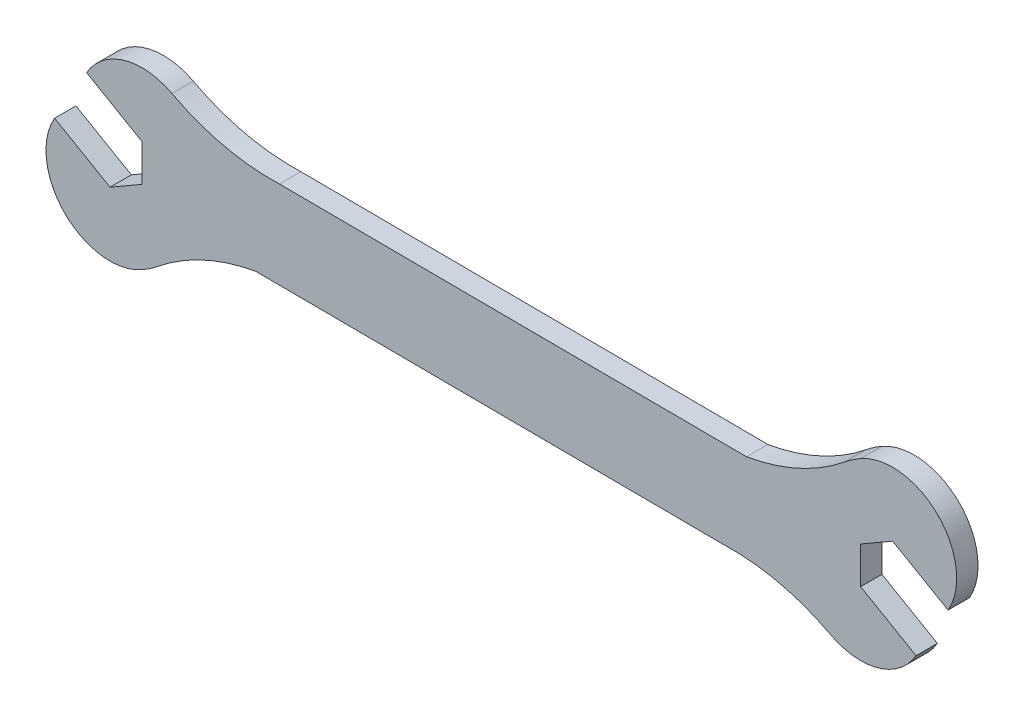
ISO-10303-21;
HEADER;
FILE_DESCRIPTION(('STEP AP214'),'2;1');
FILE_NAME('part.step','',(''),(''),'','','');
FILE_SCHEMA(('AUTOMOTIVE_DESIGN { 1 0 10303 214 1 1 1 1 }'));
ENDSEC;
DATA;
#1=APPLICATION_CONTEXT('core data for automotive mechanical design processes');
#2=APPLICATION_PROTOCOL_DEFINITION('international standard','automotive_design',2000,#1);
#3=PRODUCT_CONTEXT('',#1,'mechanical');
#4=PRODUCT('Part','Part','',(#3));
#5=PRODUCT_RELATED_PRODUCT_CATEGORY('part','',(#4));
#6=PRODUCT_DEFINITION_FORMATION('','',#4);
#7=PRODUCT_DEFINITION_CONTEXT('part definition',#1,'design');
#8=PRODUCT_DEFINITION('design','',#6,#7);
#9=PRODUCT_DEFINITION_SHAPE('','',#8);
#10=(LENGTH_UNIT() NAMED_UNIT(*) SI_UNIT(.MILLI.,.METRE.));
#11=(NAMED_UNIT(*) PLANE_ANGLE_UNIT() SI_UNIT($,.RADIAN.));
#12=(NAMED_UNIT(*) SI_UNIT($,.STERADIAN.) SOLID_ANGLE_UNIT());
#13=UNCERTAINTY_MEASURE_WITH_UNIT(LENGTH_MEASURE(1.E-05),#10,'distance_accuracy_value','');
#14=(GEOMETRIC_REPRESENTATION_CONTEXT(3) GLOBAL_UNCERTAINTY_ASSIGNED_CONTEXT((#13)) GLOBAL_UNIT_ASSIGNED_CONTEXT((#10,
#11,#12)) REPRESENTATION_CONTEXT('',''));
#15=CARTESIAN_POINT('',(0.,0.,0.));
#16=DIRECTION('',(0.,0.,1.));
#17=DIRECTION('',(1.,0.,0.));
#18=AXIS2_PLACEMENT_3D('',#15,#16,#17);
#19=CARTESIAN_POINT('',(145.422666854374,-59.2625615446269,5.));
#20=DIRECTION('',(0.,0.,-1.));
#21=DIRECTION('',(-1.,0.,0.));
#22=AXIS2_PLACEMENT_3D('',#19,#20,#21);
#23=CYLINDRICAL_SURFACE('',#22,50.0000000000001);
#24=CARTESIAN_POINT('',(145.422666854374,-59.2625615446269,0.));
#25=DIRECTION('',(0.,0.,1.));
#26=DIRECTION('',(1.,0.,0.));
#27=AXIS2_PLACEMENT_3D('',#24,#25,#26);
#28=CIRCLE('',#27,50.0000000000001);
#29=CARTESIAN_POINT('',(168.786666574287,-15.0570922326978,0.));
#30=VERTEX_POINT('',#29);
#31=CARTESIAN_POINT('',(143.609407991418,-9.29545143911929,0.));
#32=VERTEX_POINT('',#31);
#33=EDGE_CURVE('E200',#30,#32,#28,.T.);
#34=ORIENTED_EDGE('',*,*,#33,.F.);
#35=DIRECTION('',(0.,0.,-1.));
#36=VECTOR('',#35,1.);
#37=CARTESIAN_POINT('',(168.786666574287,-15.0570922326978,5.));
#38=LINE('',#37,#36);
#39=CARTESIAN_POINT('',(168.786666574287,-15.0570922326978,5.));
#40=VERTEX_POINT('',#39);
#41=EDGE_CURVE('E11',#40,#30,#38,.T.);
#42=ORIENTED_EDGE('',*,*,#41,.F.);
#43=CARTESIAN_POINT('',(145.422666854374,-59.2625615446269,5.));
#44=DIRECTION('',(0.,0.,1.));
#45=DIRECTION('',(1.,0.,0.));
#46=AXIS2_PLACEMENT_3D('',#43,#44,#45);
#47=CIRCLE('',#46,50.0000000000001);
#48=CARTESIAN_POINT('',(143.609407991418,-9.29545143911929,5.));
#49=VERTEX_POINT('',#48);
#50=EDGE_CURVE('E252',#40,#49,#47,.T.);
#51=ORIENTED_EDGE('',*,*,#50,.T.);
#52=DIRECTION('',(0.,0.,-1.));
#53=VECTOR('',#52,1.);
#54=CARTESIAN_POINT('',(143.609407991418,-9.29545143911929,5.));
#55=LINE('',#54,#53);
#56=EDGE_CURVE('E49',#49,#32,#55,.T.);
#57=ORIENTED_EDGE('',*,*,#56,.T.);
#58=EDGE_LOOP('',(#34,#42,#51,#57));
#59=FACE_BOUND('',#58,.T.);
#60=ADVANCED_FACE('F33',(#59),#23,.F.);
#61=CARTESIAN_POINT('',(175.795866490261,-1.79545143911903,5.));
#62=DIRECTION('',(0.,0.,-1.));
#63=DIRECTION('',(-1.,0.,0.));
#64=AXIS2_PLACEMENT_3D('',#61,#62,#63);
#65=CYLINDRICAL_SURFACE('',#64,15.0000000000001);
#66=CARTESIAN_POINT('',(175.795866490261,-1.79545143911903,0.));
#67=DIRECTION('',(0.,0.,1.));
#68=DIRECTION('',(1.,0.,0.));
#69=AXIS2_PLACEMENT_3D('',#66,#67,#68);
#70=CIRCLE('',#69,15.0000000000001);
#71=CARTESIAN_POINT('',(188.786247547027,-9.29545143911908,0.));
#72=VERTEX_POINT('',#71);
#73=EDGE_CURVE('E202',#30,#72,#70,.T.);
#74=ORIENTED_EDGE('',*,*,#73,.T.);
#75=DIRECTION('',(0.,0.,-1.));
#76=VECTOR('',#75,1.);
#77=CARTESIAN_POINT('',(188.786247547027,-9.29545143911908,5.));
#78=LINE('',#77,#76);
#79=CARTESIAN_POINT('',(188.786247547027,-9.29545143911908,5.));
#80=VERTEX_POINT('',#79);
#81=EDGE_CURVE('E41',#80,#72,#78,.T.);
#82=ORIENTED_EDGE('',*,*,#81,.F.);
#83=CARTESIAN_POINT('',(175.795866490261,-1.79545143911903,5.));
#84=DIRECTION('',(0.,0.,1.));
#85=DIRECTION('',(1.,0.,0.));
#86=AXIS2_PLACEMENT_3D('',#83,#84,#85);
#87=CIRCLE('',#86,15.0000000000001);
#88=EDGE_CURVE('E310',#40,#80,#87,.T.);
#89=ORIENTED_EDGE('',*,*,#88,.F.);
#90=ORIENTED_EDGE('',*,*,#41,.T.);
#91=EDGE_LOOP('',(#74,#82,#89,#90));
#92=FACE_BOUND('',#91,.T.);
#93=ADVANCED_FACE('F362',(#92),#65,.T.);
#94=CARTESIAN_POINT('',(43.1715133437962,74.7752545510925,5.));
#95=DIRECTION('',(-0.500000000000001,-0.866025403784438,0.));
#96=DIRECTION('',(0.866025403784438,-0.500000000000001,0.));
#97=AXIS2_PLACEMENT_3D('',#94,#95,#96);
#98=PLANE('',#97);
#99=DIRECTION('',(-0.866025403784438,0.500000000000001,0.));
#100=VECTOR('',#99,1.);
#101=CARTESIAN_POINT('',(43.1715133437962,74.7752545510925,0.));
#102=LINE('',#101,#100);
#103=CARTESIAN_POINT('',(175.795866490261,-1.79545143911903,0.));
#104=VERTEX_POINT('',#103);
#105=EDGE_CURVE('E204',#72,#104,#102,.T.);
#106=ORIENTED_EDGE('',*,*,#105,.T.);
#107=DIRECTION('',(0.,0.,-1.));
#108=VECTOR('',#107,1.);
#109=CARTESIAN_POINT('',(175.795866490261,-1.79545143911903,5.));
#110=LINE('',#109,#108);
#111=CARTESIAN_POINT('',(175.795866490261,-1.79545143911903,5.));
#112=VERTEX_POINT('',#111);
#113=EDGE_CURVE('E284',#112,#104,#110,.T.);
#114=ORIENTED_EDGE('',*,*,#113,.F.);
#115=DIRECTION('',(-0.866025403784438,0.500000000000001,0.));
#116=VECTOR('',#115,1.);
#117=CARTESIAN_POINT('',(43.1715133437962,74.7752545510925,5.));
#118=LINE('',#117,#116);
#119=EDGE_CURVE('E292',#80,#112,#118,.T.);
#120=ORIENTED_EDGE('',*,*,#119,.F.);
#121=ORIENTED_EDGE('',*,*,#81,.T.);
#122=EDGE_LOOP('',(#106,#114,#120,#121));
#123=FACE_BOUND('',#122,.T.);
#124=ADVANCED_FACE('F290',(#123),#98,.F.);
#125=CARTESIAN_POINT('',(175.795866490261,-5.63414819468726E-13,5.));
#126=DIRECTION('',(1.,0.,0.));
#127=DIRECTION('',(0.,1.,0.));
#128=AXIS2_PLACEMENT_3D('',#125,#126,#127);
#129=PLANE('',#128);
#130=DIRECTION('',(0.,-1.,0.));
#131=VECTOR('',#130,1.);
#132=CARTESIAN_POINT('',(175.795866490261,-5.63414819468726E-13,0.));
#133=LINE('',#132,#131);
#134=CARTESIAN_POINT('',(175.795866490261,6.86480259872541,0.));
#135=VERTEX_POINT('',#134);
#136=EDGE_CURVE('E207',#135,#104,#133,.T.);
#137=ORIENTED_EDGE('',*,*,#136,.F.);
#138=DIRECTION('',(0.,0.,-1.));
#139=VECTOR('',#138,1.);
#140=CARTESIAN_POINT('',(175.795866490261,6.86480259872541,5.));
#141=LINE('',#140,#139);
#142=CARTESIAN_POINT('',(175.795866490261,6.86480259872541,5.));
#143=VERTEX_POINT('',#142);
#144=EDGE_CURVE('E282',#143,#135,#141,.T.);
#145=ORIENTED_EDGE('',*,*,#144,.F.);
#146=DIRECTION('',(0.,-1.,0.));
#147=VECTOR('',#146,1.);
#148=CARTESIAN_POINT('',(175.795866490261,-5.63414819468726E-13,5.));
#149=LINE('',#148,#147);
#150=EDGE_CURVE('E303',#143,#112,#149,.T.);
#151=ORIENTED_EDGE('',*,*,#150,.T.);
#152=ORIENTED_EDGE('',*,*,#113,.T.);
#153=EDGE_LOOP('',(#137,#145,#151,#152));
#154=FACE_BOUND('',#153,.T.);
#155=ADVANCED_FACE('F300',(#154),#129,.T.);
#156=CARTESIAN_POINT('',(40.9764199013345,-70.9732411813877,5.));
#157=DIRECTION('',(0.500000000000001,-0.866025403784438,0.));
#158=DIRECTION('',(0.866025403784438,0.500000000000001,0.));
#159=AXIS2_PLACEMENT_3D('',#156,#157,#158);
#160=PLANE('',#159);
#161=DIRECTION('',(-0.866025403784438,-0.500000000000001,0.));
#162=VECTOR('',#161,1.);
#163=CARTESIAN_POINT('',(40.9764199013345,-70.9732411813877,0.));
#164=LINE('',#163,#162);
#165=CARTESIAN_POINT('',(183.295866490261,11.1949296176476,0.));
#166=VERTEX_POINT('',#165);
#167=EDGE_CURVE('E210',#166,#135,#164,.T.);
#168=ORIENTED_EDGE('',*,*,#167,.F.);
#169=DIRECTION('',(0.,0.,-1.));
#170=VECTOR('',#169,1.);
#171=CARTESIAN_POINT('',(183.295866490261,11.1949296176476,5.));
#172=LINE('',#171,#170);
#173=CARTESIAN_POINT('',(183.295866490261,11.1949296176476,5.));
#174=VERTEX_POINT('',#173);
#175=EDGE_CURVE('E280',#174,#166,#172,.T.);
#176=ORIENTED_EDGE('',*,*,#175,.F.);
#177=DIRECTION('',(-0.866025403784438,-0.500000000000001,0.));
#178=VECTOR('',#177,1.);
#179=CARTESIAN_POINT('',(40.9764199013345,-70.9732411813877,5.));
#180=LINE('',#179,#178);
#181=EDGE_CURVE('E306',#174,#143,#180,.T.);
#182=ORIENTED_EDGE('',*,*,#181,.T.);
#183=ORIENTED_EDGE('',*,*,#144,.T.);
#184=EDGE_LOOP('',(#168,#176,#182,#183));
#185=FACE_BOUND('',#184,.T.);
#186=ADVANCED_FACE('F512',(#185),#160,.T.);
#187=CARTESIAN_POINT('',(50.671513343796,87.765635607859,5.));
#188=DIRECTION('',(-0.5,-0.866025403784439,0.));
#189=DIRECTION('',(0.866025403784439,-0.5,0.));
#190=AXIS2_PLACEMENT_3D('',#187,#188,#189);
#191=PLANE('',#190);
#192=DIRECTION('',(-0.866025403784439,0.5,0.));
#193=VECTOR('',#192,1.);
#194=CARTESIAN_POINT('',(50.671513343796,87.765635607859,0.));
#195=LINE('',#194,#193);
#196=CARTESIAN_POINT('',(196.286247547027,3.6949296176476,0.));
#197=VERTEX_POINT('',#196);
#198=EDGE_CURVE('E213',#197,#166,#195,.T.);
#199=ORIENTED_EDGE('',*,*,#198,.F.);
#200=DIRECTION('',(0.,0.,-1.));
#201=VECTOR('',#200,1.);
#202=CARTESIAN_POINT('',(196.286247547027,3.6949296176476,5.));
#203=LINE('',#202,#201);
#204=CARTESIAN_POINT('',(196.286247547027,3.6949296176476,5.));
#205=VERTEX_POINT('',#204);
#206=EDGE_CURVE('E278',#205,#197,#203,.T.);
#207=ORIENTED_EDGE('',*,*,#206,.F.);
#208=DIRECTION('',(-0.866025403784439,0.5,0.));
#209=VECTOR('',#208,1.);
#210=CARTESIAN_POINT('',(50.671513343796,87.765635607859,5.));
#211=LINE('',#210,#209);
#212=EDGE_CURVE('E308',#205,#174,#211,.T.);
#213=ORIENTED_EDGE('',*,*,#212,.T.);
#214=ORIENTED_EDGE('',*,*,#175,.T.);
#215=EDGE_LOOP('',(#199,#207,#213,#214));
#216=FACE_BOUND('',#215,.T.);
#217=ADVANCED_FACE('F502',(#216),#191,.T.);
#218=CARTESIAN_POINT('',(183.295866490261,11.1949296176476,5.));
#219=DIRECTION('',(0.,0.,-1.));
#220=DIRECTION('',(-1.,0.,0.));
#221=AXIS2_PLACEMENT_3D('',#218,#219,#220);
#222=CYLINDRICAL_SURFACE('',#221,15.0000000000001);
#223=CARTESIAN_POINT('',(183.295866490261,11.1949296176476,0.));
#224=DIRECTION('',(0.,0.,1.));
#225=DIRECTION('',(1.,0.,0.));
#226=AXIS2_PLACEMENT_3D('',#223,#224,#225);
#227=CIRCLE('',#226,15.0000000000001);
#228=CARTESIAN_POINT('',(175.795866490261,24.1853106744143,0.));
#229=VERTEX_POINT('',#228);
#230=EDGE_CURVE('E216',#197,#229,#227,.T.);
#231=ORIENTED_EDGE('',*,*,#230,.T.);
#232=DIRECTION('',(0.,0.,-1.));
#233=VECTOR('',#232,1.);
#234=CARTESIAN_POINT('',(175.795866490261,24.1853106744143,5.));
#235=LINE('',#234,#233);
#236=CARTESIAN_POINT('',(175.795866490261,24.1853106744143,5.));
#237=VERTEX_POINT('',#236);
#238=EDGE_CURVE('E275',#237,#229,#235,.T.);
#239=ORIENTED_EDGE('',*,*,#238,.F.);
#240=CARTESIAN_POINT('',(183.295866490261,11.1949296176476,5.));
#241=DIRECTION('',(0.,0.,1.));
#242=DIRECTION('',(1.,0.,0.));
#243=AXIS2_PLACEMENT_3D('',#240,#241,#242);
#244=CIRCLE('',#243,15.0000000000001);
#245=EDGE_CURVE('E316',#205,#237,#244,.T.);
#246=ORIENTED_EDGE('',*,*,#245,.F.);
#247=ORIENTED_EDGE('',*,*,#206,.T.);
#248=EDGE_LOOP('',(#231,#239,#246,#247));
#249=FACE_BOUND('',#248,.T.);
#250=ADVANCED_FACE('F492',(#249),#222,.T.);
#251=CARTESIAN_POINT('',(190.795866490261,-1.79545143911908,5.));
#252=DIRECTION('',(0.,0.,-1.));
#253=DIRECTION('',(-1.,0.,0.));
#254=AXIS2_PLACEMENT_3D('',#251,#252,#253);
#255=CYLINDRICAL_SURFACE('',#254,30.0000000000001);
#256=CARTESIAN_POINT('',(190.795866490261,-1.79545143911908,0.));
#257=DIRECTION('',(0.,0.,1.));
#258=DIRECTION('',(1.,0.,0.));
#259=AXIS2_PLACEMENT_3D('',#256,#257,#258);
#260=CIRCLE('',#259,30.0000000000001);
#261=CARTESIAN_POINT('',(171.956702134925,21.5516230326996,0.));
#262=VERTEX_POINT('',#261);
#263=EDGE_CURVE('E218',#229,#262,#260,.T.);
#264=ORIENTED_EDGE('',*,*,#263,.T.);
#265=DIRECTION('',(0.,0.,-1.));
#266=VECTOR('',#265,1.);
#267=CARTESIAN_POINT('',(171.956702134925,21.5516230326996,5.));
#268=LINE('',#267,#266);
#269=CARTESIAN_POINT('',(171.956702134925,21.5516230326996,5.));
#270=VERTEX_POINT('',#269);
#271=EDGE_CURVE('E273',#270,#262,#268,.T.);
#272=ORIENTED_EDGE('',*,*,#271,.F.);
#273=CARTESIAN_POINT('',(190.795866490261,-1.79545143911908,5.));
#274=DIRECTION('',(0.,0.,1.));
#275=DIRECTION('',(1.,0.,0.));
#276=AXIS2_PLACEMENT_3D('',#273,#274,#275);
#277=CIRCLE('',#276,30.0000000000001);
#278=EDGE_CURVE('E318',#237,#270,#277,.T.);
#279=ORIENTED_EDGE('',*,*,#278,.F.);
#280=ORIENTED_EDGE('',*,*,#238,.T.);
#281=EDGE_LOOP('',(#264,#272,#279,#280));
#282=FACE_BOUND('',#281,.T.);
#283=ADVANCED_FACE('F482',(#282),#255,.T.);
#284=CARTESIAN_POINT('',(140.558094876032,60.463413819064,5.));
#285=DIRECTION('',(0.,0.,-1.));
#286=DIRECTION('',(-1.,0.,0.));
#287=AXIS2_PLACEMENT_3D('',#284,#285,#286);
#288=CYLINDRICAL_SURFACE('',#287,50.0000000000001);
#289=CARTESIAN_POINT('',(140.558094876032,60.463413819064,0.));
#290=DIRECTION('',(0.,0.,1.));
#291=DIRECTION('',(1.,0.,0.));
#292=AXIS2_PLACEMENT_3D('',#289,#290,#291);
#293=CIRCLE('',#292,50.0000000000001);
#294=CARTESIAN_POINT('',(149.07962434525,11.1949296176473,0.));
#295=VERTEX_POINT('',#294);
#296=EDGE_CURVE('E221',#295,#262,#293,.T.);
#297=ORIENTED_EDGE('',*,*,#296,.F.);
#298=DIRECTION('',(0.,0.,-1.));
#299=VECTOR('',#298,1.);
#300=CARTESIAN_POINT('',(149.07962434525,11.1949296176473,5.));
#301=LINE('',#300,#299);
#302=CARTESIAN_POINT('',(149.07962434525,11.1949296176473,5.));
#303=VERTEX_POINT('',#302);
#304=EDGE_CURVE('E271',#303,#295,#301,.T.);
#305=ORIENTED_EDGE('',*,*,#304,.F.);
#306=CARTESIAN_POINT('',(140.558094876032,60.463413819064,5.));
#307=DIRECTION('',(0.,0.,1.));
#308=DIRECTION('',(1.,0.,0.));
#309=AXIS2_PLACEMENT_3D('',#306,#307,#308);
#310=CIRCLE('',#309,50.0000000000001);
#311=EDGE_CURVE('E320',#303,#270,#310,.T.);
#312=ORIENTED_EDGE('',*,*,#311,.T.);
#313=ORIENTED_EDGE('',*,*,#271,.T.);
#314=EDGE_LOOP('',(#297,#305,#312,#313));
#315=FACE_BOUND('',#314,.T.);
#316=ADVANCED_FACE('F472',(#315),#288,.F.);
#317=CARTESIAN_POINT('',(0.0700279902819246,12.0601619896823,5.));
#318=DIRECTION('',(0.0058064568151831,0.999983142387537,0.));
#319=DIRECTION('',(-0.999983142387537,0.0058064568151831,0.));
#320=AXIS2_PLACEMENT_3D('',#317,#318,#319);
#321=PLANE('',#320);
#322=DIRECTION('',(0.999983142387537,-0.0058064568151831,0.));
#323=VECTOR('',#322,1.);
#324=CARTESIAN_POINT('',(0.0700279902819246,12.0601619896823,0.));
#325=LINE('',#324,#323);
#326=CARTESIAN_POINT('',(39.6864584988431,11.8301270189222,0.));
#327=VERTEX_POINT('',#326);
#328=EDGE_CURVE('E224',#327,#295,#325,.T.);
#329=ORIENTED_EDGE('',*,*,#328,.F.);
#330=DIRECTION('',(0.,0.,-1.));
#331=VECTOR('',#330,1.);
#332=CARTESIAN_POINT('',(39.6864584988431,11.8301270189222,5.));
#333=LINE('',#332,#331);
#334=CARTESIAN_POINT('',(39.6864584988431,11.8301270189222,5.));
#335=VERTEX_POINT('',#334);
#336=EDGE_CURVE('E269',#335,#327,#333,.T.);
#337=ORIENTED_EDGE('',*,*,#336,.F.);
#338=DIRECTION('',(0.999983142387537,-0.0058064568151831,0.));
#339=VECTOR('',#338,1.);
#340=CARTESIAN_POINT('',(0.0700279902819246,12.0601619896823,5.));
#341=LINE('',#340,#339);
#342=EDGE_CURVE('E323',#335,#303,#341,.T.);
#343=ORIENTED_EDGE('',*,*,#342,.T.);
#344=ORIENTED_EDGE('',*,*,#304,.T.);
#345=EDGE_LOOP('',(#329,#337,#343,#344));
#346=FACE_BOUND('',#345,.T.);
#347=ADVANCED_FACE('F462',(#346),#321,.T.);
#348=CARTESIAN_POINT('',(37.8731996358877,61.7972371244298,5.));
#349=DIRECTION('',(0.,0.,-1.));
#350=DIRECTION('',(-1.,0.,0.));
#351=AXIS2_PLACEMENT_3D('',#348,#349,#350);
#352=CYLINDRICAL_SURFACE('',#351,50.0000000000001);
#353=CARTESIAN_POINT('',(37.8731996358877,61.7972371244298,0.));
#354=DIRECTION('',(0.,0.,1.));
#355=DIRECTION('',(1.,0.,0.));
#356=AXIS2_PLACEMENT_3D('',#353,#354,#355);
#357=CIRCLE('',#356,50.0000000000001);
#358=CARTESIAN_POINT('',(14.5091999159741,17.5917678125009,0.));
#359=VERTEX_POINT('',#358);
#360=EDGE_CURVE('E227',#359,#327,#357,.T.);
#361=ORIENTED_EDGE('',*,*,#360,.F.);
#362=DIRECTION('',(0.,0.,-1.));
#363=VECTOR('',#362,1.);
#364=CARTESIAN_POINT('',(14.5091999159741,17.5917678125009,5.));
#365=LINE('',#364,#363);
#366=CARTESIAN_POINT('',(14.5091999159741,17.5917678125009,5.));
#367=VERTEX_POINT('',#366);
#368=EDGE_CURVE('E267',#367,#359,#365,.T.);
#369=ORIENTED_EDGE('',*,*,#368,.F.);
#370=CARTESIAN_POINT('',(37.8731996358877,61.7972371244298,5.));
#371=DIRECTION('',(0.,0.,1.));
#372=DIRECTION('',(1.,0.,0.));
#373=AXIS2_PLACEMENT_3D('',#370,#371,#372);
#374=CIRCLE('',#373,50.0000000000001);
#375=EDGE_CURVE('E326',#367,#335,#374,.T.);
#376=ORIENTED_EDGE('',*,*,#375,.T.);
#377=ORIENTED_EDGE('',*,*,#336,.T.);
#378=EDGE_LOOP('',(#361,#369,#376,#377));
#379=FACE_BOUND('',#378,.T.);
#380=ADVANCED_FACE('F452',(#379),#352,.F.);
#381=CARTESIAN_POINT('',(7.50000000000006,4.33012701892223,5.));
#382=DIRECTION('',(0.,0.,-1.));
#383=DIRECTION('',(-1.,0.,0.));
#384=AXIS2_PLACEMENT_3D('',#381,#382,#383);
#385=CYLINDRICAL_SURFACE('',#384,15.0000000000001);
#386=CARTESIAN_POINT('',(7.50000000000006,4.33012701892223,0.));
#387=DIRECTION('',(0.,0.,1.));
#388=DIRECTION('',(1.,0.,0.));
#389=AXIS2_PLACEMENT_3D('',#386,#387,#388);
#390=CIRCLE('',#389,15.0000000000001);
#391=CARTESIAN_POINT('',(-5.49038105676652,11.8301270189222,0.));
#392=VERTEX_POINT('',#391);
#393=EDGE_CURVE('E230',#359,#392,#390,.T.);
#394=ORIENTED_EDGE('',*,*,#393,.T.);
#395=DIRECTION('',(0.,0.,-1.));
#396=VECTOR('',#395,1.);
#397=CARTESIAN_POINT('',(-5.49038105676652,11.8301270189222,5.));
#398=LINE('',#397,#396);
#399=CARTESIAN_POINT('',(-5.49038105676652,11.8301270189222,5.));
#400=VERTEX_POINT('',#399);
#401=EDGE_CURVE('E264',#400,#392,#398,.T.);
#402=ORIENTED_EDGE('',*,*,#401,.F.);
#403=CARTESIAN_POINT('',(7.50000000000006,4.33012701892223,5.));
#404=DIRECTION('',(0.,0.,1.));
#405=DIRECTION('',(1.,0.,0.));
#406=AXIS2_PLACEMENT_3D('',#403,#404,#405);
#407=CIRCLE('',#406,15.0000000000001);
#408=EDGE_CURVE('E329',#367,#400,#407,.T.);
#409=ORIENTED_EDGE('',*,*,#408,.F.);
#410=ORIENTED_EDGE('',*,*,#368,.T.);
#411=EDGE_LOOP('',(#394,#402,#409,#410));
#412=FACE_BOUND('',#411,.T.);
#413=ADVANCED_FACE('F441',(#412),#385,.T.);
#414=CARTESIAN_POINT('',(3.75000000000003,6.49519052838334,5.));
#415=DIRECTION('',(0.5,0.866025403784439,0.));
#416=DIRECTION('',(-0.866025403784439,0.5,0.));
#417=AXIS2_PLACEMENT_3D('',#414,#415,#416);
#418=PLANE('',#417);
#419=DIRECTION('',(0.866025403784439,-0.5,0.));
#420=VECTOR('',#419,1.);
#421=CARTESIAN_POINT('',(3.75000000000003,6.49519052838334,0.));
#422=LINE('',#421,#420);
#423=CARTESIAN_POINT('',(7.50000000000006,4.33012701892223,0.));
#424=VERTEX_POINT('',#423);
#425=EDGE_CURVE('E232',#392,#424,#422,.T.);
#426=ORIENTED_EDGE('',*,*,#425,.T.);
#427=DIRECTION('',(0.,0.,-1.));
#428=VECTOR('',#427,1.);
#429=CARTESIAN_POINT('',(7.50000000000006,4.33012701892223,5.));
#430=LINE('',#429,#428);
#431=CARTESIAN_POINT('',(7.50000000000006,4.33012701892223,5.));
#432=VERTEX_POINT('',#431);
#433=EDGE_CURVE('E262',#432,#424,#430,.T.);
#434=ORIENTED_EDGE('',*,*,#433,.F.);
#435=DIRECTION('',(0.866025403784439,-0.5,0.));
#436=VECTOR('',#435,1.);
#437=CARTESIAN_POINT('',(3.75000000000003,6.49519052838334,5.));
#438=LINE('',#437,#436);
#439=EDGE_CURVE('E331',#400,#432,#438,.T.);
#440=ORIENTED_EDGE('',*,*,#439,.F.);
#441=ORIENTED_EDGE('',*,*,#401,.T.);
#442=EDGE_LOOP('',(#426,#434,#440,#441));
#443=FACE_BOUND('',#442,.T.);
#444=ADVANCED_FACE('F431',(#443),#418,.F.);
#445=CARTESIAN_POINT('',(7.50000000000006,0.,5.));
#446=DIRECTION('',(-1.,0.,0.));
#447=DIRECTION('',(0.,-1.,0.));
#448=AXIS2_PLACEMENT_3D('',#445,#446,#447);
#449=PLANE('',#448);
#450=DIRECTION('',(0.,1.,0.));
#451=VECTOR('',#450,1.);
#452=CARTESIAN_POINT('',(7.50000000000006,0.,0.));
#453=LINE('',#452,#451);
#454=CARTESIAN_POINT('',(7.50000000000006,-4.33012701892223,0.));
#455=VERTEX_POINT('',#454);
#456=EDGE_CURVE('E235',#455,#424,#453,.T.);
#457=ORIENTED_EDGE('',*,*,#456,.F.);
#458=DIRECTION('',(0.,0.,-1.));
#459=VECTOR('',#458,1.);
#460=CARTESIAN_POINT('',(7.50000000000006,-4.33012701892223,5.));
#461=LINE('',#460,#459);
#462=CARTESIAN_POINT('',(7.50000000000006,-4.33012701892223,5.));
#463=VERTEX_POINT('',#462);
#464=EDGE_CURVE('E260',#463,#455,#461,.T.);
#465=ORIENTED_EDGE('',*,*,#464,.F.);
#466=DIRECTION('',(0.,1.,0.));
#467=VECTOR('',#466,1.);
#468=CARTESIAN_POINT('',(7.50000000000006,0.,5.));
#469=LINE('',#468,#467);
#470=EDGE_CURVE('E333',#463,#432,#469,.T.);
#471=ORIENTED_EDGE('',*,*,#470,.T.);
#472=ORIENTED_EDGE('',*,*,#433,.T.);
#473=EDGE_LOOP('',(#457,#465,#471,#472));
#474=FACE_BOUND('',#473,.T.);
#475=ADVANCED_FACE('F422',(#474),#449,.T.);
#476=CARTESIAN_POINT('',(3.75000000000003,-6.49519052838334,5.));
#477=DIRECTION('',(-0.5,0.866025403784439,0.));
#478=DIRECTION('',(-0.866025403784439,-0.5,0.));
#479=AXIS2_PLACEMENT_3D('',#476,#477,#478);
#480=PLANE('',#479);
#481=DIRECTION('',(0.866025403784439,0.5,0.));
#482=VECTOR('',#481,1.);
#483=CARTESIAN_POINT('',(3.75000000000003,-6.49519052838334,0.));
#484=LINE('',#483,#482);
#485=CARTESIAN_POINT('',(0.,-8.66025403784446,0.));
#486=VERTEX_POINT('',#485);
#487=EDGE_CURVE('E238',#486,#455,#484,.T.);
#488=ORIENTED_EDGE('',*,*,#487,.F.);
#489=DIRECTION('',(0.,0.,-1.));
#490=VECTOR('',#489,1.);
#491=CARTESIAN_POINT('',(0.,-8.66025403784446,5.));
#492=LINE('',#491,#490);
#493=CARTESIAN_POINT('',(0.,-8.66025403784446,5.));
#494=VERTEX_POINT('',#493);
#495=EDGE_CURVE('E258',#494,#486,#492,.T.);
#496=ORIENTED_EDGE('',*,*,#495,.F.);
#497=DIRECTION('',(0.866025403784439,0.5,0.));
#498=VECTOR('',#497,1.);
#499=CARTESIAN_POINT('',(3.75000000000003,-6.49519052838334,5.));
#500=LINE('',#499,#498);
#501=EDGE_CURVE('E336',#494,#463,#500,.T.);
#502=ORIENTED_EDGE('',*,*,#501,.T.);
#503=ORIENTED_EDGE('',*,*,#464,.T.);
#504=EDGE_LOOP('',(#488,#496,#502,#503));
#505=FACE_BOUND('',#504,.T.);
#506=ADVANCED_FACE('F348',(#505),#480,.T.);
#507=CARTESIAN_POINT('',(-3.75000000000003,-6.49519052838334,5.));
#508=DIRECTION('',(0.5,0.866025403784439,0.));
#509=DIRECTION('',(-0.866025403784439,0.5,0.));
#510=AXIS2_PLACEMENT_3D('',#507,#508,#509);
#511=PLANE('',#510);
#512=DIRECTION('',(0.866025403784439,-0.5,0.));
#513=VECTOR('',#512,1.);
#514=CARTESIAN_POINT('',(-3.75000000000003,-6.49519052838334,0.));
#515=LINE('',#514,#513);
#516=CARTESIAN_POINT('',(-12.9903810567667,-1.16025403784439,0.));
#517=VERTEX_POINT('',#516);
#518=EDGE_CURVE('E241',#517,#486,#515,.T.);
#519=ORIENTED_EDGE('',*,*,#518,.F.);
#520=DIRECTION('',(0.,0.,-1.));
#521=VECTOR('',#520,1.);
#522=CARTESIAN_POINT('',(-12.9903810567667,-1.16025403784439,5.));
#523=LINE('',#522,#521);
#524=CARTESIAN_POINT('',(-12.9903810567667,-1.16025403784439,5.));
#525=VERTEX_POINT('',#524);
#526=EDGE_CURVE('E256',#525,#517,#523,.T.);
#527=ORIENTED_EDGE('',*,*,#526,.F.);
#528=DIRECTION('',(0.866025403784439,-0.5,0.));
#529=VECTOR('',#528,1.);
#530=CARTESIAN_POINT('',(-3.75000000000003,-6.49519052838334,5.));
#531=LINE('',#530,#529);
#532=EDGE_CURVE('E339',#525,#494,#531,.T.);
#533=ORIENTED_EDGE('',*,*,#532,.T.);
#534=ORIENTED_EDGE('',*,*,#495,.T.);
#535=EDGE_LOOP('',(#519,#527,#533,#534));
#536=FACE_BOUND('',#535,.T.);
#537=ADVANCED_FACE('F343',(#536),#511,.T.);
#538=CARTESIAN_POINT('',(0.,-8.66025403784446,5.));
#539=DIRECTION('',(0.,0.,-1.));
#540=DIRECTION('',(-1.,0.,0.));
#541=AXIS2_PLACEMENT_3D('',#538,#539,#540);
#542=CYLINDRICAL_SURFACE('',#541,15.0000000000001);
#543=CARTESIAN_POINT('',(0.,-8.66025403784446,0.));
#544=DIRECTION('',(0.,0.,1.));
#545=DIRECTION('',(1.,0.,0.));
#546=AXIS2_PLACEMENT_3D('',#543,#544,#545);
#547=CIRCLE('',#546,15.0000000000001);
#548=CARTESIAN_POINT('',(7.50000000000006,-21.6506350946111,0.));
#549=VERTEX_POINT('',#548);
#550=EDGE_CURVE('E244',#517,#549,#547,.T.);
#551=ORIENTED_EDGE('',*,*,#550,.T.);
#552=DIRECTION('',(0.,0.,-1.));
#553=VECTOR('',#552,1.);
#554=CARTESIAN_POINT('',(7.50000000000006,-21.6506350946111,5.));
#555=LINE('',#554,#553);
#556=CARTESIAN_POINT('',(7.50000000000006,-21.6506350946111,5.));
#557=VERTEX_POINT('',#556);
#558=EDGE_CURVE('E192',#557,#549,#555,.T.);
#559=ORIENTED_EDGE('',*,*,#558,.F.);
#560=CARTESIAN_POINT('',(0.,-8.66025403784446,5.));
#561=DIRECTION('',(0.,0.,1.));
#562=DIRECTION('',(1.,0.,0.));
#563=AXIS2_PLACEMENT_3D('',#560,#561,#562);
#564=CIRCLE('',#563,15.0000000000001);
#565=EDGE_CURVE('E180',#525,#557,#564,.T.);
#566=ORIENTED_EDGE('',*,*,#565,.F.);
#567=ORIENTED_EDGE('',*,*,#526,.T.);
#568=EDGE_LOOP('',(#551,#559,#566,#567));
#569=FACE_BOUND('',#568,.T.);
#570=ADVANCED_FACE('F352',(#569),#542,.T.);
#571=CARTESIAN_POINT('',(-7.50000000000006,4.33012701892224,5.));
#572=DIRECTION('',(0.,0.,-1.));
#573=DIRECTION('',(-1.,0.,0.));
#574=AXIS2_PLACEMENT_3D('',#571,#572,#573);
#575=CYLINDRICAL_SURFACE('',#574,30.0000000000003);
#576=CARTESIAN_POINT('',(-7.50000000000006,4.33012701892224,0.));
#577=DIRECTION('',(0.,0.,1.));
#578=DIRECTION('',(1.,0.,0.));
#579=AXIS2_PLACEMENT_3D('',#576,#577,#578);
#580=CIRCLE('',#579,30.0000000000003);
#581=CARTESIAN_POINT('',(11.3391643553358,-19.0169474528966,0.));
#582=VERTEX_POINT('',#581);
#583=EDGE_CURVE('E189',#549,#582,#580,.T.);
#584=ORIENTED_EDGE('',*,*,#583,.T.);
#585=DIRECTION('',(0.,0.,-1.));
#586=VECTOR('',#585,1.);
#587=CARTESIAN_POINT('',(11.3391643553358,-19.0169474528966,5.));
#588=LINE('',#587,#586);
#589=CARTESIAN_POINT('',(11.3391643553358,-19.0169474528966,5.));
#590=VERTEX_POINT('',#589);
#591=EDGE_CURVE('E186',#590,#582,#588,.T.);
#592=ORIENTED_EDGE('',*,*,#591,.F.);
#593=CARTESIAN_POINT('',(-7.50000000000006,4.33012701892224,5.));
#594=DIRECTION('',(0.,0.,1.));
#595=DIRECTION('',(1.,0.,0.));
#596=AXIS2_PLACEMENT_3D('',#593,#594,#595);
#597=CIRCLE('',#596,30.0000000000003);
#598=EDGE_CURVE('E171',#557,#590,#597,.T.);
#599=ORIENTED_EDGE('',*,*,#598,.F.);
#600=ORIENTED_EDGE('',*,*,#558,.T.);
#601=EDGE_LOOP('',(#584,#592,#599,#600));
#602=FACE_BOUND('',#601,.T.);
#603=ADVANCED_FACE('F187',(#602),#575,.T.);
#604=CARTESIAN_POINT('',(42.7377716142287,-57.9287382392611,5.));
#605=DIRECTION('',(0.,0.,-1.));
#606=DIRECTION('',(-1.,0.,0.));
#607=AXIS2_PLACEMENT_3D('',#604,#605,#606);
#608=CYLINDRICAL_SURFACE('',#607,50.);
#609=CARTESIAN_POINT('',(42.7377716142287,-57.9287382392611,0.));
#610=DIRECTION('',(0.,0.,1.));
#611=DIRECTION('',(1.,0.,0.));
#612=AXIS2_PLACEMENT_3D('',#609,#610,#611);
#613=CIRCLE('',#612,50.);
#614=CARTESIAN_POINT('',(34.2162421450104,-8.66025403784445,0.));
#615=VERTEX_POINT('',#614);
#616=EDGE_CURVE('E247',#615,#582,#613,.T.);
#617=ORIENTED_EDGE('',*,*,#616,.F.);
#618=DIRECTION('',(0.,0.,-1.));
#619=VECTOR('',#618,1.);
#620=CARTESIAN_POINT('',(34.2162421450104,-8.66025403784445,5.));
#621=LINE('',#620,#619);
#622=CARTESIAN_POINT('',(34.2162421450104,-8.66025403784445,5.));
#623=VERTEX_POINT('',#622);
#624=EDGE_CURVE('E110',#623,#615,#621,.T.);
#625=ORIENTED_EDGE('',*,*,#624,.F.);
#626=CARTESIAN_POINT('',(42.7377716142287,-57.9287382392611,5.));
#627=DIRECTION('',(0.,0.,1.));
#628=DIRECTION('',(1.,0.,0.));
#629=AXIS2_PLACEMENT_3D('',#626,#627,#628);
#630=CIRCLE('',#629,50.);
#631=EDGE_CURVE('E177',#623,#590,#630,.T.);
#632=ORIENTED_EDGE('',*,*,#631,.T.);
#633=ORIENTED_EDGE('',*,*,#591,.T.);
#634=EDGE_LOOP('',(#617,#625,#632,#633));
#635=FACE_BOUND('',#634,.T.);
#636=ADVANCED_FACE('F194',(#635),#608,.F.);
#637=CARTESIAN_POINT('',(-0.049130944811125,-8.46129027468829,5.));
#638=DIRECTION('',(-0.00580645681518205,-0.999983142387537,0.));
#639=DIRECTION('',(0.999983142387537,-0.00580645681518205,0.));
#640=AXIS2_PLACEMENT_3D('',#637,#638,#639);
#641=PLANE('',#640);
#642=DIRECTION('',(-0.999983142387537,0.00580645681518205,0.));
#643=VECTOR('',#642,1.);
#644=CARTESIAN_POINT('',(-0.049130944811125,-8.46129027468829,0.));
#645=LINE('',#644,#643);
#646=EDGE_CURVE('E249',#32,#615,#645,.T.);
#647=ORIENTED_EDGE('',*,*,#646,.F.);
#648=ORIENTED_EDGE('',*,*,#56,.F.);
#649=DIRECTION('',(-0.999983142387537,0.00580645681518205,0.));
#650=VECTOR('',#649,1.);
#651=CARTESIAN_POINT('',(-0.049130944811125,-8.46129027468829,5.));
#652=LINE('',#651,#650);
#653=EDGE_CURVE('E195',#49,#623,#652,.T.);
#654=ORIENTED_EDGE('',*,*,#653,.T.);
#655=ORIENTED_EDGE('',*,*,#624,.T.);
#656=EDGE_LOOP('',(#647,#648,#654,#655));
#657=FACE_BOUND('',#656,.T.);
#658=ADVANCED_FACE('F366',(#657),#641,.T.);
#659=CARTESIAN_POINT('',(0.,0.,5.));
#660=DIRECTION('',(0.,0.,1.));
#661=DIRECTION('',(1.,0.,0.));
#662=AXIS2_PLACEMENT_3D('',#659,#660,#661);
#663=PLANE('',#662);
#664=ORIENTED_EDGE('',*,*,#50,.F.);
#665=ORIENTED_EDGE('',*,*,#88,.T.);
#666=ORIENTED_EDGE('',*,*,#119,.T.);
#667=ORIENTED_EDGE('',*,*,#150,.F.);
#668=ORIENTED_EDGE('',*,*,#181,.F.);
#669=ORIENTED_EDGE('',*,*,#212,.F.);
#670=ORIENTED_EDGE('',*,*,#245,.T.);
#671=ORIENTED_EDGE('',*,*,#278,.T.);
#672=ORIENTED_EDGE('',*,*,#311,.F.);
#673=ORIENTED_EDGE('',*,*,#342,.F.);
#674=ORIENTED_EDGE('',*,*,#375,.F.);
#675=ORIENTED_EDGE('',*,*,#408,.T.);
#676=ORIENTED_EDGE('',*,*,#439,.T.);
#677=ORIENTED_EDGE('',*,*,#470,.F.);
#678=ORIENTED_EDGE('',*,*,#501,.F.);
#679=ORIENTED_EDGE('',*,*,#532,.F.);
#680=ORIENTED_EDGE('',*,*,#565,.T.);
#681=ORIENTED_EDGE('',*,*,#598,.T.);
#682=ORIENTED_EDGE('',*,*,#631,.F.);
#683=ORIENTED_EDGE('',*,*,#653,.F.);
#684=EDGE_LOOP('',(#664,#665,#666,#667,#668,#669,#670,#671,#672,#673,#674,#675,#676,#677,#678,
#679,#680,#681,#682,#683));
#685=FACE_BOUND('',#684,.T.);
#686=ADVANCED_FACE('F174',(#685),#663,.T.);
#687=CARTESIAN_POINT('',(0.,0.,0.));
#688=DIRECTION('',(0.,0.,1.));
#689=DIRECTION('',(1.,0.,0.));
#690=AXIS2_PLACEMENT_3D('',#687,#688,#689);
#691=PLANE('',#690);
#692=ORIENTED_EDGE('',*,*,#33,.T.);
#693=ORIENTED_EDGE('',*,*,#646,.T.);
#694=ORIENTED_EDGE('',*,*,#616,.T.);
#695=ORIENTED_EDGE('',*,*,#583,.F.);
#696=ORIENTED_EDGE('',*,*,#550,.F.);
#697=ORIENTED_EDGE('',*,*,#518,.T.);
#698=ORIENTED_EDGE('',*,*,#487,.T.);
#699=ORIENTED_EDGE('',*,*,#456,.T.);
#700=ORIENTED_EDGE('',*,*,#425,.F.);
#701=ORIENTED_EDGE('',*,*,#393,.F.);
#702=ORIENTED_EDGE('',*,*,#360,.T.);
#703=ORIENTED_EDGE('',*,*,#328,.T.);
#704=ORIENTED_EDGE('',*,*,#296,.T.);
#705=ORIENTED_EDGE('',*,*,#263,.F.);
#706=ORIENTED_EDGE('',*,*,#230,.F.);
#707=ORIENTED_EDGE('',*,*,#198,.T.);
#708=ORIENTED_EDGE('',*,*,#167,.T.);
#709=ORIENTED_EDGE('',*,*,#136,.T.);
#710=ORIENTED_EDGE('',*,*,#105,.F.);
#711=ORIENTED_EDGE('',*,*,#73,.F.);
#712=EDGE_LOOP('',(#692,#693,#694,#695,#696,#697,#698,#699,#700,#701,#702,#703,#704,#705,#706,
#707,#708,#709,#710,#711));
#713=FACE_BOUND('',#712,.T.);
#714=ADVANCED_FACE('F296',(#713),#691,.F.);
#715=CLOSED_SHELL('',(#60,#93,#124,#155,#186,#217,#250,#283,#316,#347,#380,#413,#444,#475,#506,
#537,#570,#603,#636,#658,#686,#714));
#716=MANIFOLD_SOLID_BREP('B2',#715);
#717=ADVANCED_BREP_SHAPE_REPRESENTATION('',(#18,#716),#14);
#718=SHAPE_DEFINITION_REPRESENTATION(#9,#717);
ENDSEC;
END-ISO-10303-21;
